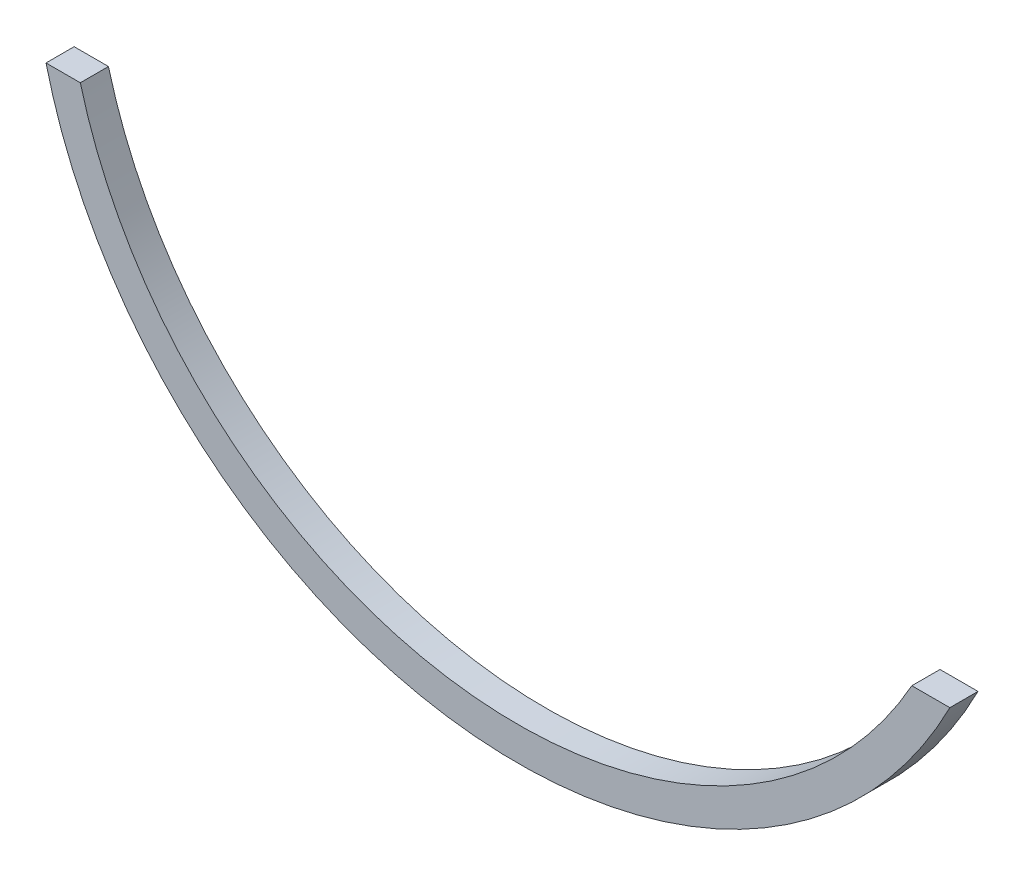
ISO-10303-21;
HEADER;
FILE_DESCRIPTION(('STEP AP214'),'2;1');
FILE_NAME('part.step','',(''),(''),'','','');
FILE_SCHEMA(('AUTOMOTIVE_DESIGN { 1 0 10303 214 1 1 1 1 }'));
ENDSEC;
DATA;
#1=APPLICATION_CONTEXT('core data for automotive mechanical design processes');
#2=APPLICATION_PROTOCOL_DEFINITION('international standard','automotive_design',2000,#1);
#3=PRODUCT_CONTEXT('',#1,'mechanical');
#4=PRODUCT('Part','Part','',(#3));
#5=PRODUCT_RELATED_PRODUCT_CATEGORY('part','',(#4));
#6=PRODUCT_DEFINITION_FORMATION('','',#4);
#7=PRODUCT_DEFINITION_CONTEXT('part definition',#1,'design');
#8=PRODUCT_DEFINITION('design','',#6,#7);
#9=PRODUCT_DEFINITION_SHAPE('','',#8);
#10=(LENGTH_UNIT() NAMED_UNIT(*) SI_UNIT(.MILLI.,.METRE.));
#11=(NAMED_UNIT(*) PLANE_ANGLE_UNIT() SI_UNIT($,.RADIAN.));
#12=(NAMED_UNIT(*) SI_UNIT($,.STERADIAN.) SOLID_ANGLE_UNIT());
#13=UNCERTAINTY_MEASURE_WITH_UNIT(LENGTH_MEASURE(1.E-05),#10,'distance_accuracy_value','');
#14=(GEOMETRIC_REPRESENTATION_CONTEXT(3) GLOBAL_UNCERTAINTY_ASSIGNED_CONTEXT((#13)) GLOBAL_UNIT_ASSIGNED_CONTEXT((#10,
#11,#12)) REPRESENTATION_CONTEXT('',''));
#15=CARTESIAN_POINT('',(0.,0.,0.));
#16=DIRECTION('',(0.,0.,1.));
#17=DIRECTION('',(1.,0.,0.));
#18=AXIS2_PLACEMENT_3D('',#15,#16,#17);
#19=CARTESIAN_POINT('',(0.,0.,3.175));
#20=DIRECTION('',(0.,0.,-1.));
#21=DIRECTION('',(-1.,0.,0.));
#22=AXIS2_PLACEMENT_3D('',#19,#20,#21);
#23=CYLINDRICAL_SURFACE('',#22,102.);
#24=CARTESIAN_POINT('',(0.,0.,-3.175));
#25=DIRECTION('',(0.,0.,-1.));
#26=DIRECTION('',(1.,0.,0.));
#27=AXIS2_PLACEMENT_3D('',#24,#25,#26);
#28=CIRCLE('',#27,102.);
#29=CARTESIAN_POINT('',(88.9044430835714,-49.9999999999999,-3.175));
#30=VERTEX_POINT('',#29);
#31=CARTESIAN_POINT('',(-98.6306240475036,-26.,-3.175));
#32=VERTEX_POINT('',#31);
#33=EDGE_CURVE('E102',#30,#32,#28,.T.);
#34=ORIENTED_EDGE('',*,*,#33,.T.);
#35=DIRECTION('',(0.,0.,-1.));
#36=VECTOR('',#35,1.);
#37=CARTESIAN_POINT('',(-98.6306240475036,-26.,3.175));
#38=LINE('',#37,#36);
#39=CARTESIAN_POINT('',(-98.6306240475036,-26.,3.175));
#40=VERTEX_POINT('',#39);
#41=EDGE_CURVE('E11',#40,#32,#38,.T.);
#42=ORIENTED_EDGE('',*,*,#41,.F.);
#43=CARTESIAN_POINT('',(0.,0.,3.175));
#44=DIRECTION('',(0.,0.,-1.));
#45=DIRECTION('',(1.,0.,0.));
#46=AXIS2_PLACEMENT_3D('',#43,#44,#45);
#47=CIRCLE('',#46,102.);
#48=CARTESIAN_POINT('',(88.9044430835714,-49.9999999999999,3.175));
#49=VERTEX_POINT('',#48);
#50=EDGE_CURVE('E90',#49,#40,#47,.T.);
#51=ORIENTED_EDGE('',*,*,#50,.F.);
#52=DIRECTION('',(0.,0.,-1.));
#53=VECTOR('',#52,1.);
#54=CARTESIAN_POINT('',(88.9044430835714,-49.9999999999999,3.175));
#55=LINE('',#54,#53);
#56=EDGE_CURVE('E98',#49,#30,#55,.T.);
#57=ORIENTED_EDGE('',*,*,#56,.T.);
#58=EDGE_LOOP('',(#34,#42,#51,#57));
#59=FACE_BOUND('',#58,.T.);
#60=ADVANCED_FACE('F39',(#59),#23,.F.);
#61=CARTESIAN_POINT('',(-106.368463371434,-26.,3.175));
#62=DIRECTION('',(0.,-1.,0.));
#63=DIRECTION('',(1.,0.,0.));
#64=AXIS2_PLACEMENT_3D('',#61,#62,#63);
#65=PLANE('',#64);
#66=DIRECTION('',(-1.,0.,0.));
#67=VECTOR('',#66,1.);
#68=CARTESIAN_POINT('',(-106.368463371434,-26.,-3.175));
#69=LINE('',#68,#67);
#70=CARTESIAN_POINT('',(-106.368463371434,-26.,-3.175));
#71=VERTEX_POINT('',#70);
#72=EDGE_CURVE('E94',#32,#71,#69,.T.);
#73=ORIENTED_EDGE('',*,*,#72,.T.);
#74=DIRECTION('',(0.,0.,-1.));
#75=VECTOR('',#74,1.);
#76=CARTESIAN_POINT('',(-106.368463371434,-26.,3.175));
#77=LINE('',#76,#75);
#78=CARTESIAN_POINT('',(-106.368463371434,-26.,3.175));
#79=VERTEX_POINT('',#78);
#80=EDGE_CURVE('E47',#79,#71,#77,.T.);
#81=ORIENTED_EDGE('',*,*,#80,.F.);
#82=DIRECTION('',(-1.,0.,0.));
#83=VECTOR('',#82,1.);
#84=CARTESIAN_POINT('',(-106.368463371434,-26.,3.175));
#85=LINE('',#84,#83);
#86=EDGE_CURVE('E85',#40,#79,#85,.T.);
#87=ORIENTED_EDGE('',*,*,#86,.F.);
#88=ORIENTED_EDGE('',*,*,#41,.T.);
#89=EDGE_LOOP('',(#73,#81,#87,#88));
#90=FACE_BOUND('',#89,.T.);
#91=ADVANCED_FACE('F93',(#90),#65,.F.);
#92=CARTESIAN_POINT('',(0.0184358709413874,-0.0755391648590009,3.175));
#93=DIRECTION('',(0.,0.,-1.));
#94=DIRECTION('',(-1.,0.,0.));
#95=AXIS2_PLACEMENT_3D('',#92,#93,#94);
#96=CYLINDRICAL_SURFACE('',#95,109.5);
#97=CARTESIAN_POINT('',(0.0184358709413874,-0.0755391648590009,-3.175));
#98=DIRECTION('',(0.,0.,1.));
#99=DIRECTION('',(1.,0.,0.));
#100=AXIS2_PLACEMENT_3D('',#97,#98,#99);
#101=CIRCLE('',#100,109.5);
#102=CARTESIAN_POINT('',(97.4750837217703,-50.,-3.175));
#103=VERTEX_POINT('',#102);
#104=EDGE_CURVE('E72',#71,#103,#101,.T.);
#105=ORIENTED_EDGE('',*,*,#104,.T.);
#106=DIRECTION('',(0.,0.,-1.));
#107=VECTOR('',#106,1.);
#108=CARTESIAN_POINT('',(97.4750837217703,-50.,3.175));
#109=LINE('',#108,#107);
#110=CARTESIAN_POINT('',(97.4750837217703,-50.,3.175));
#111=VERTEX_POINT('',#110);
#112=EDGE_CURVE('E95',#111,#103,#109,.T.);
#113=ORIENTED_EDGE('',*,*,#112,.F.);
#114=CARTESIAN_POINT('',(0.0184358709413874,-0.0755391648590009,3.175));
#115=DIRECTION('',(0.,0.,1.));
#116=DIRECTION('',(1.,0.,0.));
#117=AXIS2_PLACEMENT_3D('',#114,#115,#116);
#118=CIRCLE('',#117,109.5);
#119=EDGE_CURVE('E88',#79,#111,#118,.T.);
#120=ORIENTED_EDGE('',*,*,#119,.F.);
#121=ORIENTED_EDGE('',*,*,#80,.T.);
#122=EDGE_LOOP('',(#105,#113,#120,#121));
#123=FACE_BOUND('',#122,.T.);
#124=ADVANCED_FACE('F96',(#123),#96,.T.);
#125=CARTESIAN_POINT('',(88.9044430835714,-49.9999999999999,3.175));
#126=DIRECTION('',(0.,-1.,0.));
#127=DIRECTION('',(1.,0.,0.));
#128=AXIS2_PLACEMENT_3D('',#125,#126,#127);
#129=PLANE('',#128);
#130=DIRECTION('',(-1.,0.,0.));
#131=VECTOR('',#130,1.);
#132=CARTESIAN_POINT('',(88.9044430835714,-49.9999999999999,-3.175));
#133=LINE('',#132,#131);
#134=EDGE_CURVE('E78',#103,#30,#133,.T.);
#135=ORIENTED_EDGE('',*,*,#134,.T.);
#136=ORIENTED_EDGE('',*,*,#56,.F.);
#137=DIRECTION('',(-1.,0.,0.));
#138=VECTOR('',#137,1.);
#139=CARTESIAN_POINT('',(88.9044430835714,-49.9999999999999,3.175));
#140=LINE('',#139,#138);
#141=EDGE_CURVE('E55',#111,#49,#140,.T.);
#142=ORIENTED_EDGE('',*,*,#141,.F.);
#143=ORIENTED_EDGE('',*,*,#112,.T.);
#144=EDGE_LOOP('',(#135,#136,#142,#143));
#145=FACE_BOUND('',#144,.T.);
#146=ADVANCED_FACE('F109',(#145),#129,.F.);
#147=CARTESIAN_POINT('',(0.,0.,3.175));
#148=DIRECTION('',(0.,0.,1.));
#149=DIRECTION('',(1.,0.,0.));
#150=AXIS2_PLACEMENT_3D('',#147,#148,#149);
#151=PLANE('',#150);
#152=ORIENTED_EDGE('',*,*,#50,.T.);
#153=ORIENTED_EDGE('',*,*,#86,.T.);
#154=ORIENTED_EDGE('',*,*,#119,.T.);
#155=ORIENTED_EDGE('',*,*,#141,.T.);
#156=EDGE_LOOP('',(#152,#153,#154,#155));
#157=FACE_BOUND('',#156,.T.);
#158=ADVANCED_FACE('F86',(#157),#151,.T.);
#159=CARTESIAN_POINT('',(0.,0.,-3.175));
#160=DIRECTION('',(0.,0.,1.));
#161=DIRECTION('',(1.,0.,0.));
#162=AXIS2_PLACEMENT_3D('',#159,#160,#161);
#163=PLANE('',#162);
#164=ORIENTED_EDGE('',*,*,#33,.F.);
#165=ORIENTED_EDGE('',*,*,#134,.F.);
#166=ORIENTED_EDGE('',*,*,#104,.F.);
#167=ORIENTED_EDGE('',*,*,#72,.F.);
#168=EDGE_LOOP('',(#164,#165,#166,#167));
#169=FACE_BOUND('',#168,.T.);
#170=ADVANCED_FACE('F112',(#169),#163,.F.);
#171=CLOSED_SHELL('',(#60,#91,#124,#146,#158,#170));
#172=MANIFOLD_SOLID_BREP('B2',#171);
#173=ADVANCED_BREP_SHAPE_REPRESENTATION('',(#18,#172),#14);
#174=SHAPE_DEFINITION_REPRESENTATION(#9,#173);
ENDSEC;
END-ISO-10303-21;
